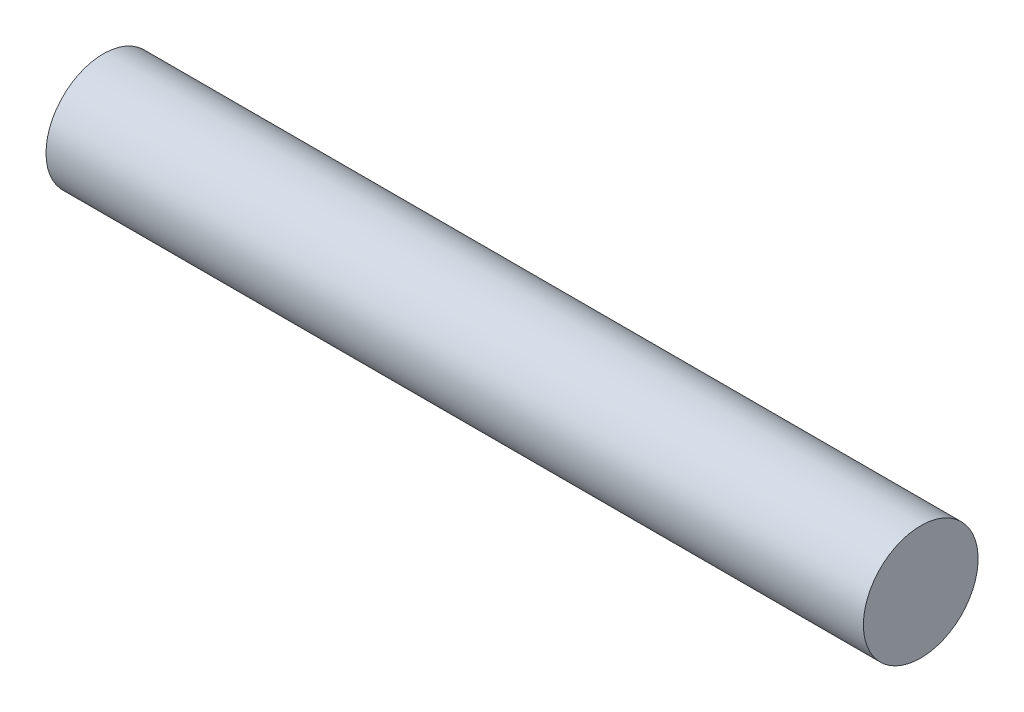
ISO-10303-21;
HEADER;
FILE_DESCRIPTION(('STEP AP214'),'2;1');
FILE_NAME('part.step','',(''),(''),'','','');
FILE_SCHEMA(('AUTOMOTIVE_DESIGN { 1 0 10303 214 1 1 1 1 }'));
ENDSEC;
DATA;
#1=APPLICATION_CONTEXT('core data for automotive mechanical design processes');
#2=APPLICATION_PROTOCOL_DEFINITION('international standard','automotive_design',2000,#1);
#3=PRODUCT_CONTEXT('',#1,'mechanical');
#4=PRODUCT('Part','Part','',(#3));
#5=PRODUCT_RELATED_PRODUCT_CATEGORY('part','',(#4));
#6=PRODUCT_DEFINITION_FORMATION('','',#4);
#7=PRODUCT_DEFINITION_CONTEXT('part definition',#1,'design');
#8=PRODUCT_DEFINITION('design','',#6,#7);
#9=PRODUCT_DEFINITION_SHAPE('','',#8);
#10=(LENGTH_UNIT() NAMED_UNIT(*) SI_UNIT(.MILLI.,.METRE.));
#11=(NAMED_UNIT(*) PLANE_ANGLE_UNIT() SI_UNIT($,.RADIAN.));
#12=(NAMED_UNIT(*) SI_UNIT($,.STERADIAN.) SOLID_ANGLE_UNIT());
#13=UNCERTAINTY_MEASURE_WITH_UNIT(LENGTH_MEASURE(1.E-05),#10,'distance_accuracy_value','');
#14=(GEOMETRIC_REPRESENTATION_CONTEXT(3) GLOBAL_UNCERTAINTY_ASSIGNED_CONTEXT((#13)) GLOBAL_UNIT_ASSIGNED_CONTEXT((#10,
#11,#12)) REPRESENTATION_CONTEXT('',''));
#15=CARTESIAN_POINT('',(0.,0.,0.));
#16=DIRECTION('',(0.,0.,1.));
#17=DIRECTION('',(1.,0.,0.));
#18=AXIS2_PLACEMENT_3D('',#15,#16,#17);
#19=CARTESIAN_POINT('',(28.5,0.,0.));
#20=DIRECTION('',(-1.,0.,0.));
#21=DIRECTION('',(0.,0.,1.));
#22=AXIS2_PLACEMENT_3D('',#19,#20,#21);
#23=PLANE('',#22);
#24=CARTESIAN_POINT('',(28.5,0.,0.));
#25=DIRECTION('',(-1.,0.,0.));
#26=DIRECTION('',(0.,0.,1.));
#27=AXIS2_PLACEMENT_3D('',#24,#25,#26);
#28=CIRCLE('',#27,4.);
#29=CARTESIAN_POINT('',(28.5,0.,4.));
#30=VERTEX_POINT('',#29);
#31=EDGE_CURVE('E37',#30,#30,#28,.T.);
#32=ORIENTED_EDGE('',*,*,#31,.F.);
#33=EDGE_LOOP('',(#32));
#34=FACE_BOUND('',#33,.T.);
#35=ADVANCED_FACE('F31',(#34),#23,.F.);
#36=CARTESIAN_POINT('',(-28.5,0.,0.));
#37=DIRECTION('',(1.,0.,0.));
#38=DIRECTION('',(0.,0.,-1.));
#39=AXIS2_PLACEMENT_3D('',#36,#37,#38);
#40=PLANE('',#39);
#41=CARTESIAN_POINT('',(-28.5,0.,0.));
#42=DIRECTION('',(-1.,0.,0.));
#43=DIRECTION('',(0.,0.,1.));
#44=AXIS2_PLACEMENT_3D('',#41,#42,#43);
#45=CIRCLE('',#44,4.);
#46=CARTESIAN_POINT('',(-28.5,0.,4.));
#47=VERTEX_POINT('',#46);
#48=EDGE_CURVE('E10',#47,#47,#45,.T.);
#49=ORIENTED_EDGE('',*,*,#48,.T.);
#50=EDGE_LOOP('',(#49));
#51=FACE_BOUND('',#50,.T.);
#52=ADVANCED_FACE('F46',(#51),#40,.F.);
#53=CARTESIAN_POINT('',(-38.901213553489,0.,0.));
#54=DIRECTION('',(-1.,0.,0.));
#55=DIRECTION('',(0.,0.,1.));
#56=AXIS2_PLACEMENT_3D('',#53,#54,#55);
#57=CYLINDRICAL_SURFACE('',#56,4.);
#58=ORIENTED_EDGE('',*,*,#48,.F.);
#59=EDGE_LOOP('',(#58));
#60=FACE_BOUND('',#59,.T.);
#61=ORIENTED_EDGE('',*,*,#31,.T.);
#62=EDGE_LOOP('',(#61));
#63=FACE_BOUND('',#62,.T.);
#64=ADVANCED_FACE('F43',(#60,#63),#57,.T.);
#65=CLOSED_SHELL('',(#35,#52,#64));
#66=MANIFOLD_SOLID_BREP('B2',#65);
#67=ADVANCED_BREP_SHAPE_REPRESENTATION('',(#18,#66),#14);
#68=SHAPE_DEFINITION_REPRESENTATION(#9,#67);
ENDSEC;
END-ISO-10303-21;
